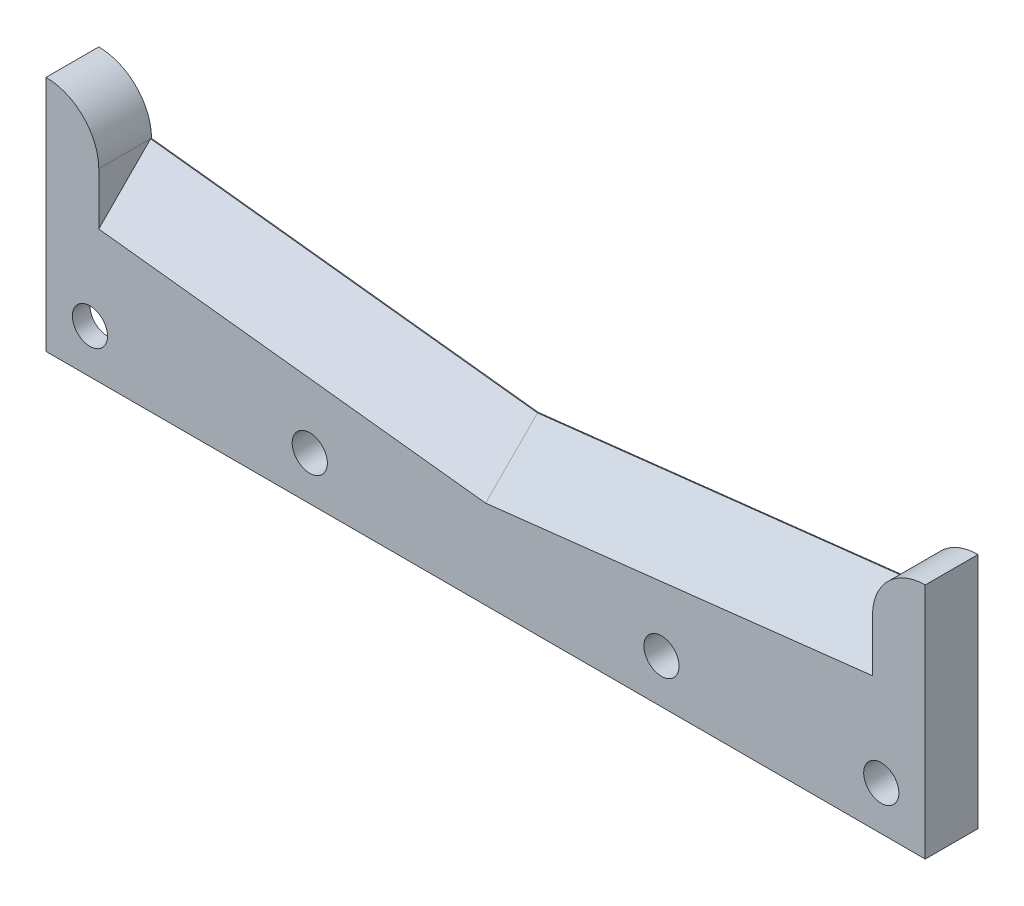
ISO-10303-21;
HEADER;
FILE_DESCRIPTION(('STEP AP214'),'2;1');
FILE_NAME('part.step','',(''),(''),'','','');
FILE_SCHEMA(('AUTOMOTIVE_DESIGN { 1 0 10303 214 1 1 1 1 }'));
ENDSEC;
DATA;
#1=APPLICATION_CONTEXT('core data for automotive mechanical design processes');
#2=APPLICATION_PROTOCOL_DEFINITION('international standard','automotive_design',2000,#1);
#3=PRODUCT_CONTEXT('',#1,'mechanical');
#4=PRODUCT('Part','Part','',(#3));
#5=PRODUCT_RELATED_PRODUCT_CATEGORY('part','',(#4));
#6=PRODUCT_DEFINITION_FORMATION('','',#4);
#7=PRODUCT_DEFINITION_CONTEXT('part definition',#1,'design');
#8=PRODUCT_DEFINITION('design','',#6,#7);
#9=PRODUCT_DEFINITION_SHAPE('','',#8);
#10=(LENGTH_UNIT() NAMED_UNIT(*) SI_UNIT(.MILLI.,.METRE.));
#11=(NAMED_UNIT(*) PLANE_ANGLE_UNIT() SI_UNIT($,.RADIAN.));
#12=(NAMED_UNIT(*) SI_UNIT($,.STERADIAN.) SOLID_ANGLE_UNIT());
#13=UNCERTAINTY_MEASURE_WITH_UNIT(LENGTH_MEASURE(1.E-05),#10,'distance_accuracy_value','');
#14=(GEOMETRIC_REPRESENTATION_CONTEXT(3) GLOBAL_UNCERTAINTY_ASSIGNED_CONTEXT((#13)) GLOBAL_UNIT_ASSIGNED_CONTEXT((#10,
#11,#12)) REPRESENTATION_CONTEXT('',''));
#15=CARTESIAN_POINT('',(0.,0.,0.));
#16=DIRECTION('',(0.,0.,1.));
#17=DIRECTION('',(1.,0.,0.));
#18=AXIS2_PLACEMENT_3D('',#15,#16,#17);
#19=CARTESIAN_POINT('',(0.,0.,0.));
#20=DIRECTION('',(0.,1.,0.));
#21=DIRECTION('',(1.,0.,0.));
#22=AXIS2_PLACEMENT_3D('',#19,#20,#21);
#23=PLANE('',#22);
#24=DIRECTION('',(0.707106781186548,0.,-0.707106781186548));
#25=VECTOR('',#24,1.);
#26=CARTESIAN_POINT('',(16.95000000001,0.,6.95000000001));
#27=LINE('',#26,#25);
#28=CARTESIAN_POINT('',(20.,0.,3.9));
#29=VERTEX_POINT('',#28);
#30=CARTESIAN_POINT('',(23.9,0.,0.));
#31=VERTEX_POINT('',#30);
#32=EDGE_CURVE('E11',#29,#31,#27,.T.);
#33=ORIENTED_EDGE('',*,*,#32,.T.);
#34=DIRECTION('',(1.,0.,0.));
#35=VECTOR('',#34,1.);
#36=CARTESIAN_POINT('',(0.,0.,0.));
#37=LINE('',#36,#35);
#38=CARTESIAN_POINT('',(100.,0.,0.));
#39=VERTEX_POINT('',#38);
#40=EDGE_CURVE('E28',#31,#39,#37,.T.);
#41=ORIENTED_EDGE('',*,*,#40,.T.);
#42=DIRECTION('',(0.,0.,1.));
#43=VECTOR('',#42,1.);
#44=CARTESIAN_POINT('',(100.00000000001,0.,0.));
#45=LINE('',#44,#43);
#46=CARTESIAN_POINT('',(100.,0.,6.));
#47=VERTEX_POINT('',#46);
#48=EDGE_CURVE('E153',#39,#47,#45,.T.);
#49=ORIENTED_EDGE('',*,*,#48,.T.);
#50=DIRECTION('',(1.,0.,0.));
#51=VECTOR('',#50,1.);
#52=CARTESIAN_POINT('',(0.,0.,6.00000000001));
#53=LINE('',#52,#51);
#54=CARTESIAN_POINT('',(0.,0.,6.));
#55=VERTEX_POINT('',#54);
#56=EDGE_CURVE('E149',#55,#47,#53,.T.);
#57=ORIENTED_EDGE('',*,*,#56,.F.);
#58=DIRECTION('',(0.,0.,1.));
#59=VECTOR('',#58,1.);
#60=CARTESIAN_POINT('',(1.00001836970251E-11,0.,0.));
#61=LINE('',#60,#59);
#62=CARTESIAN_POINT('',(0.,0.,4.));
#63=VERTEX_POINT('',#62);
#64=EDGE_CURVE('E151',#63,#55,#61,.T.);
#65=ORIENTED_EDGE('',*,*,#64,.F.);
#66=DIRECTION('',(-1.,0.,0.));
#67=VECTOR('',#66,1.);
#68=CARTESIAN_POINT('',(20.00000000001,0.,4.00000000001));
#69=LINE('',#68,#67);
#70=CARTESIAN_POINT('',(20.,0.,4.));
#71=VERTEX_POINT('',#70);
#72=EDGE_CURVE('E279',#71,#63,#69,.T.);
#73=ORIENTED_EDGE('',*,*,#72,.F.);
#74=DIRECTION('',(0.,0.,1.));
#75=VECTOR('',#74,1.);
#76=CARTESIAN_POINT('',(20.00000000001,0.,0.));
#77=LINE('',#76,#75);
#78=EDGE_CURVE('E234',#29,#71,#77,.T.);
#79=ORIENTED_EDGE('',*,*,#78,.F.);
#80=EDGE_LOOP('',(#33,#41,#49,#57,#65,#73,#79));
#81=FACE_BOUND('',#80,.T.);
#82=ADVANCED_FACE('F17',(#81),#23,.F.);
#83=CARTESIAN_POINT('',(20.,12.727272727273,0.));
#84=DIRECTION('',(1.,0.,0.));
#85=DIRECTION('',(0.,1.,0.));
#86=AXIS2_PLACEMENT_3D('',#83,#84,#85);
#87=PLANE('',#86);
#88=DIRECTION('',(0.,-1.,0.));
#89=VECTOR('',#88,1.);
#90=CARTESIAN_POINT('',(20.00000000001,12.727272727283,3.90000000001));
#91=LINE('',#90,#89);
#92=CARTESIAN_POINT('',(20.,12.727272727273,3.9));
#93=VERTEX_POINT('',#92);
#94=EDGE_CURVE('E237',#93,#29,#91,.T.);
#95=ORIENTED_EDGE('',*,*,#94,.T.);
#96=ORIENTED_EDGE('',*,*,#78,.T.);
#97=DIRECTION('',(0.,-1.,0.));
#98=VECTOR('',#97,1.);
#99=CARTESIAN_POINT('',(20.00000000001,12.727272727283,4.00000000001));
#100=LINE('',#99,#98);
#101=CARTESIAN_POINT('',(20.,12.727272727273,4.));
#102=VERTEX_POINT('',#101);
#103=EDGE_CURVE('E288',#102,#71,#100,.T.);
#104=ORIENTED_EDGE('',*,*,#103,.F.);
#105=DIRECTION('',(0.,0.,1.));
#106=VECTOR('',#105,1.);
#107=CARTESIAN_POINT('',(20.00000000001,12.727272727283,0.));
#108=LINE('',#107,#106);
#109=EDGE_CURVE('E270',#93,#102,#108,.T.);
#110=ORIENTED_EDGE('',*,*,#109,.F.);
#111=EDGE_LOOP('',(#95,#96,#104,#110));
#112=FACE_BOUND('',#111,.T.);
#113=ADVANCED_FACE('F382',(#112),#87,.F.);
#114=CARTESIAN_POINT('',(21.95,12.727272727273,1.95));
#115=DIRECTION('',(-0.707106781186548,0.,-0.707106781186548));
#116=DIRECTION('',(-0.707106781186548,0.,0.707106781186548));
#117=AXIS2_PLACEMENT_3D('',#114,#115,#116);
#118=PLANE('',#117);
#119=DIRECTION('',(0.,-1.,0.));
#120=VECTOR('',#119,1.);
#121=CARTESIAN_POINT('',(23.90000000001,12.727272727283,0.));
#122=LINE('',#121,#120);
#123=CARTESIAN_POINT('',(23.9,16.209190923609,0.));
#124=VERTEX_POINT('',#123);
#125=EDGE_CURVE('E238',#124,#31,#122,.T.);
#126=ORIENTED_EDGE('',*,*,#125,.T.);
#127=ORIENTED_EDGE('',*,*,#32,.F.);
#128=ORIENTED_EDGE('',*,*,#94,.F.);
#129=DIRECTION('',(0.597924984539922,0.533827149671003,-0.597924984539922));
#130=VECTOR('',#129,1.);
#131=CARTESIAN_POINT('',(19.145605724827,11.964469913538,4.754394275193));
#132=LINE('',#131,#130);
#133=EDGE_CURVE('E197',#93,#124,#132,.T.);
#134=ORIENTED_EDGE('',*,*,#133,.T.);
#135=EDGE_LOOP('',(#126,#127,#128,#134));
#136=FACE_BOUND('',#135,.T.);
#137=ADVANCED_FACE('F387',(#136),#118,.T.);
#138=CARTESIAN_POINT('',(0.,0.,4.));
#139=DIRECTION('',(0.,0.,1.));
#140=DIRECTION('',(1.,0.,0.));
#141=AXIS2_PLACEMENT_3D('',#138,#139,#140);
#142=PLANE('',#141);
#143=DIRECTION('',(0.,1.,0.));
#144=VECTOR('',#143,1.);
#145=CARTESIAN_POINT('',(0.,0.,4.00000000001));
#146=LINE('',#145,#144);
#147=CARTESIAN_POINT('',(0.,15.,4.));
#148=VERTEX_POINT('',#147);
#149=EDGE_CURVE('E167',#63,#148,#146,.T.);
#150=ORIENTED_EDGE('',*,*,#149,.T.);
#151=DIRECTION('',(0.99360525478876,-0.112909688052723,0.));
#152=VECTOR('',#151,1.);
#153=CARTESIAN_POINT('',(0.,15.00000000001,4.00000000001));
#154=LINE('',#153,#152);
#155=EDGE_CURVE('E198',#148,#102,#154,.T.);
#156=ORIENTED_EDGE('',*,*,#155,.T.);
#157=ORIENTED_EDGE('',*,*,#103,.T.);
#158=ORIENTED_EDGE('',*,*,#72,.T.);
#159=EDGE_LOOP('',(#150,#156,#157,#158));
#160=FACE_BOUND('',#159,.T.);
#161=CARTESIAN_POINT('',(5.00000000001,5.00000000001,4.00000000001));
#162=DIRECTION('',(0.,0.,1.));
#163=DIRECTION('',(1.,0.,0.));
#164=AXIS2_PLACEMENT_3D('',#161,#162,#163);
#165=CIRCLE('',#164,2.00000000001);
#166=CARTESIAN_POINT('',(7.00000000002,5.00000000001,4.00000000001));
#167=VERTEX_POINT('',#166);
#168=EDGE_CURVE('E276',#167,#167,#165,.T.);
#169=ORIENTED_EDGE('',*,*,#168,.T.);
#170=EDGE_LOOP('',(#169));
#171=FACE_BOUND('',#170,.T.);
#172=ADVANCED_FACE('F384',(#160,#171),#142,.F.);
#173=CARTESIAN_POINT('',(50.,16.,0.));
#174=DIRECTION('',(0.,0.,1.));
#175=DIRECTION('',(1.,0.,0.));
#176=AXIS2_PLACEMENT_3D('',#173,#174,#175);
#177=PLANE('',#176);
#178=CARTESIAN_POINT('',(100.00000000001,21.00000000001,0.));
#179=DIRECTION('',(0.,0.,1.));
#180=DIRECTION('',(1.,0.,0.));
#181=AXIS2_PLACEMENT_3D('',#178,#179,#180);
#182=CIRCLE('',#181,6.00000000001);
#183=CARTESIAN_POINT('',(100.,27.,0.));
#184=VERTEX_POINT('',#183);
#185=CARTESIAN_POINT('',(94.,21.,0.));
#186=VERTEX_POINT('',#185);
#187=EDGE_CURVE('E187',#184,#186,#182,.T.);
#188=ORIENTED_EDGE('',*,*,#187,.F.);
#189=DIRECTION('',(0.,1.,0.));
#190=VECTOR('',#189,1.);
#191=CARTESIAN_POINT('',(100.00000000001,0.,0.));
#192=LINE('',#191,#190);
#193=EDGE_CURVE('E177',#39,#184,#192,.T.);
#194=ORIENTED_EDGE('',*,*,#193,.F.);
#195=ORIENTED_EDGE('',*,*,#40,.F.);
#196=ORIENTED_EDGE('',*,*,#125,.F.);
#197=DIRECTION('',(0.99360525478876,-0.112909688052723,0.));
#198=VECTOR('',#197,1.);
#199=CARTESIAN_POINT('',(6.440347783383,18.193242311872,0.));
#200=LINE('',#199,#198);
#201=CARTESIAN_POINT('',(0.,18.925100014518,0.));
#202=VERTEX_POINT('',#201);
#203=EDGE_CURVE('E228',#202,#124,#200,.T.);
#204=ORIENTED_EDGE('',*,*,#203,.F.);
#205=DIRECTION('',(0.,-1.,0.));
#206=VECTOR('',#205,1.);
#207=CARTESIAN_POINT('',(0.,21.00000000001,0.));
#208=LINE('',#207,#206);
#209=CARTESIAN_POINT('',(0.,27.,0.));
#210=VERTEX_POINT('',#209);
#211=EDGE_CURVE('E229',#210,#202,#208,.T.);
#212=ORIENTED_EDGE('',*,*,#211,.F.);
#213=CARTESIAN_POINT('',(0.,21.00000000001,0.));
#214=DIRECTION('',(0.,0.,1.));
#215=DIRECTION('',(1.,0.,0.));
#216=AXIS2_PLACEMENT_3D('',#213,#214,#215);
#217=CIRCLE('',#216,6.00000000001);
#218=CARTESIAN_POINT('',(6.,21.,0.));
#219=VERTEX_POINT('',#218);
#220=EDGE_CURVE('E220',#219,#210,#217,.T.);
#221=ORIENTED_EDGE('',*,*,#220,.F.);
#222=DIRECTION('',(-0.99360525478876,0.112909688052723,0.));
#223=VECTOR('',#222,1.);
#224=CARTESIAN_POINT('',(50.00000000001,16.00000000001,0.));
#225=LINE('',#224,#223);
#226=CARTESIAN_POINT('',(50.,16.,0.));
#227=VERTEX_POINT('',#226);
#228=EDGE_CURVE('E189',#227,#219,#225,.T.);
#229=ORIENTED_EDGE('',*,*,#228,.F.);
#230=DIRECTION('',(0.99360525478876,0.112909688052723,0.));
#231=VECTOR('',#230,1.);
#232=CARTESIAN_POINT('',(50.00000000001,16.00000000001,0.));
#233=LINE('',#232,#231);
#234=EDGE_CURVE('E280',#227,#186,#233,.T.);
#235=ORIENTED_EDGE('',*,*,#234,.T.);
#236=EDGE_LOOP('',(#188,#194,#195,#196,#204,#212,#221,#229,#235));
#237=FACE_BOUND('',#236,.T.);
#238=CARTESIAN_POINT('',(70.00000000001,5.00000000001,0.));
#239=DIRECTION('',(0.,0.,1.));
#240=DIRECTION('',(1.,0.,0.));
#241=AXIS2_PLACEMENT_3D('',#238,#239,#240);
#242=CIRCLE('',#241,2.00000000001);
#243=CARTESIAN_POINT('',(72.00000000002,5.00000000001,0.));
#244=VERTEX_POINT('',#243);
#245=EDGE_CURVE('E292',#244,#244,#242,.T.);
#246=ORIENTED_EDGE('',*,*,#245,.T.);
#247=EDGE_LOOP('',(#246));
#248=FACE_BOUND('',#247,.T.);
#249=CARTESIAN_POINT('',(30.00000000001,5.00000000001,0.));
#250=DIRECTION('',(0.,0.,1.));
#251=DIRECTION('',(1.,0.,0.));
#252=AXIS2_PLACEMENT_3D('',#249,#250,#251);
#253=CIRCLE('',#252,2.00000000001);
#254=CARTESIAN_POINT('',(32.00000000002,5.00000000001,0.));
#255=VERTEX_POINT('',#254);
#256=EDGE_CURVE('E263',#255,#255,#253,.T.);
#257=ORIENTED_EDGE('',*,*,#256,.T.);
#258=EDGE_LOOP('',(#257));
#259=FACE_BOUND('',#258,.T.);
#260=CARTESIAN_POINT('',(95.00000000001,5.00000000001,0.));
#261=DIRECTION('',(0.,0.,1.));
#262=DIRECTION('',(1.,0.,0.));
#263=AXIS2_PLACEMENT_3D('',#260,#261,#262);
#264=CIRCLE('',#263,2.00000000001);
#265=CARTESIAN_POINT('',(97.00000000002,5.00000000001,0.));
#266=VERTEX_POINT('',#265);
#267=EDGE_CURVE('E168',#266,#266,#264,.T.);
#268=ORIENTED_EDGE('',*,*,#267,.T.);
#269=EDGE_LOOP('',(#268));
#270=FACE_BOUND('',#269,.T.);
#271=ADVANCED_FACE('F370',(#237,#248,#259,#270),#177,.F.);
#272=CARTESIAN_POINT('',(0.,0.,0.));
#273=DIRECTION('',(-1.,0.,0.));
#274=DIRECTION('',(0.,0.,1.));
#275=AXIS2_PLACEMENT_3D('',#272,#273,#274);
#276=PLANE('',#275);
#277=ORIENTED_EDGE('',*,*,#149,.F.);
#278=ORIENTED_EDGE('',*,*,#64,.T.);
#279=DIRECTION('',(0.,1.,0.));
#280=VECTOR('',#279,1.);
#281=CARTESIAN_POINT('',(1.00003673940397E-11,0.,6.00000000001));
#282=LINE('',#281,#280);
#283=CARTESIAN_POINT('',(0.,27.,6.));
#284=VERTEX_POINT('',#283);
#285=EDGE_CURVE('E163',#55,#284,#282,.T.);
#286=ORIENTED_EDGE('',*,*,#285,.T.);
#287=DIRECTION('',(0.,0.,1.));
#288=VECTOR('',#287,1.);
#289=CARTESIAN_POINT('',(1.00003673940397E-11,27.00000000001,0.));
#290=LINE('',#289,#288);
#291=EDGE_CURVE('E224',#210,#284,#290,.T.);
#292=ORIENTED_EDGE('',*,*,#291,.F.);
#293=ORIENTED_EDGE('',*,*,#211,.T.);
#294=DIRECTION('',(0.,0.709371267804266,-0.704835019287328));
#295=VECTOR('',#294,1.);
#296=CARTESIAN_POINT('',(1.00003641082614E-11,13.175902906889,5.712432456982));
#297=LINE('',#296,#295);
#298=CARTESIAN_POINT('',(0.,15.,3.9));
#299=VERTEX_POINT('',#298);
#300=EDGE_CURVE('E209',#299,#202,#297,.T.);
#301=ORIENTED_EDGE('',*,*,#300,.F.);
#302=DIRECTION('',(0.,0.,1.));
#303=VECTOR('',#302,1.);
#304=CARTESIAN_POINT('',(0.,15.00000000001,0.));
#305=LINE('',#304,#303);
#306=EDGE_CURVE('E225',#299,#148,#305,.T.);
#307=ORIENTED_EDGE('',*,*,#306,.T.);
#308=EDGE_LOOP('',(#277,#278,#286,#292,#293,#301,#307));
#309=FACE_BOUND('',#308,.T.);
#310=ADVANCED_FACE('F161',(#309),#276,.T.);
#311=CARTESIAN_POINT('',(100.,0.,0.));
#312=DIRECTION('',(-1.,0.,0.));
#313=DIRECTION('',(0.,0.,1.));
#314=AXIS2_PLACEMENT_3D('',#311,#312,#313);
#315=PLANE('',#314);
#316=ORIENTED_EDGE('',*,*,#193,.T.);
#317=DIRECTION('',(0.,0.,1.));
#318=VECTOR('',#317,1.);
#319=CARTESIAN_POINT('',(100.00000000001,27.00000000001,0.));
#320=LINE('',#319,#318);
#321=CARTESIAN_POINT('',(100.,27.,6.));
#322=VERTEX_POINT('',#321);
#323=EDGE_CURVE('E251',#184,#322,#320,.T.);
#324=ORIENTED_EDGE('',*,*,#323,.T.);
#325=DIRECTION('',(0.,1.,0.));
#326=VECTOR('',#325,1.);
#327=CARTESIAN_POINT('',(100.00000000001,0.,6.00000000001));
#328=LINE('',#327,#326);
#329=EDGE_CURVE('E158',#47,#322,#328,.T.);
#330=ORIENTED_EDGE('',*,*,#329,.F.);
#331=ORIENTED_EDGE('',*,*,#48,.F.);
#332=EDGE_LOOP('',(#316,#324,#330,#331));
#333=FACE_BOUND('',#332,.T.);
#334=ADVANCED_FACE('F618',(#333),#315,.F.);
#335=CARTESIAN_POINT('',(50.,16.,6.));
#336=DIRECTION('',(0.,0.,1.));
#337=DIRECTION('',(1.,0.,0.));
#338=AXIS2_PLACEMENT_3D('',#335,#336,#337);
#339=PLANE('',#338);
#340=DIRECTION('',(-0.99360525478876,0.112909688052723,0.));
#341=VECTOR('',#340,1.);
#342=CARTESIAN_POINT('',(49.333832840549,10.137728996751,6.00000000001));
#343=LINE('',#342,#341);
#344=CARTESIAN_POINT('',(50.,10.062028183166,6.));
#345=VERTEX_POINT('',#344);
#346=CARTESIAN_POINT('',(6.,15.062028183166,6.));
#347=VERTEX_POINT('',#346);
#348=EDGE_CURVE('E157',#345,#347,#343,.T.);
#349=ORIENTED_EDGE('',*,*,#348,.T.);
#350=DIRECTION('',(0.,1.,0.));
#351=VECTOR('',#350,1.);
#352=CARTESIAN_POINT('',(6.00000000001,11.00000000001,6.00000000001));
#353=LINE('',#352,#351);
#354=CARTESIAN_POINT('',(6.,21.,6.));
#355=VERTEX_POINT('',#354);
#356=EDGE_CURVE('E213',#347,#355,#353,.T.);
#357=ORIENTED_EDGE('',*,*,#356,.T.);
#358=CARTESIAN_POINT('',(0.,21.00000000001,6.00000000001));
#359=DIRECTION('',(0.,0.,1.));
#360=DIRECTION('',(1.,0.,0.));
#361=AXIS2_PLACEMENT_3D('',#358,#359,#360);
#362=CIRCLE('',#361,6.00000000001);
#363=EDGE_CURVE('E175',#355,#284,#362,.T.);
#364=ORIENTED_EDGE('',*,*,#363,.T.);
#365=ORIENTED_EDGE('',*,*,#285,.F.);
#366=ORIENTED_EDGE('',*,*,#56,.T.);
#367=ORIENTED_EDGE('',*,*,#329,.T.);
#368=CARTESIAN_POINT('',(100.00000000001,21.00000000001,6.00000000001));
#369=DIRECTION('',(0.,0.,1.));
#370=DIRECTION('',(1.,0.,0.));
#371=AXIS2_PLACEMENT_3D('',#368,#369,#370);
#372=CIRCLE('',#371,6.00000000001);
#373=CARTESIAN_POINT('',(94.,21.,6.));
#374=VERTEX_POINT('',#373);
#375=EDGE_CURVE('E216',#322,#374,#372,.T.);
#376=ORIENTED_EDGE('',*,*,#375,.T.);
#377=DIRECTION('',(0.,-1.,0.));
#378=VECTOR('',#377,1.);
#379=CARTESIAN_POINT('',(94.00000000001,21.00000000001,6.00000000001));
#380=LINE('',#379,#378);
#381=CARTESIAN_POINT('',(94.,15.062028183166,6.));
#382=VERTEX_POINT('',#381);
#383=EDGE_CURVE('E250',#374,#382,#380,.T.);
#384=ORIENTED_EDGE('',*,*,#383,.T.);
#385=DIRECTION('',(0.99360525478876,0.112909688052723,0.));
#386=VECTOR('',#385,1.);
#387=CARTESIAN_POINT('',(50.666167159471,10.137728996751,6.00000000001));
#388=LINE('',#387,#386);
#389=EDGE_CURVE('E212',#345,#382,#388,.T.);
#390=ORIENTED_EDGE('',*,*,#389,.F.);
#391=EDGE_LOOP('',(#349,#357,#364,#365,#366,#367,#376,#384,#390));
#392=FACE_BOUND('',#391,.T.);
#393=CARTESIAN_POINT('',(5.00000000001,5.00000000001,6.00000000001));
#394=DIRECTION('',(0.,0.,1.));
#395=DIRECTION('',(1.,0.,0.));
#396=AXIS2_PLACEMENT_3D('',#393,#394,#395);
#397=CIRCLE('',#396,2.00000000001);
#398=CARTESIAN_POINT('',(7.00000000002,5.00000000001,6.00000000001));
#399=VERTEX_POINT('',#398);
#400=EDGE_CURVE('E193',#399,#399,#397,.T.);
#401=ORIENTED_EDGE('',*,*,#400,.F.);
#402=EDGE_LOOP('',(#401));
#403=FACE_BOUND('',#402,.T.);
#404=CARTESIAN_POINT('',(30.00000000001,5.00000000001,6.00000000001));
#405=DIRECTION('',(0.,0.,1.));
#406=DIRECTION('',(1.,0.,0.));
#407=AXIS2_PLACEMENT_3D('',#404,#405,#406);
#408=CIRCLE('',#407,2.00000000001);
#409=CARTESIAN_POINT('',(32.00000000002,5.00000000001,6.00000000001));
#410=VERTEX_POINT('',#409);
#411=EDGE_CURVE('E240',#410,#410,#408,.T.);
#412=ORIENTED_EDGE('',*,*,#411,.F.);
#413=EDGE_LOOP('',(#412));
#414=FACE_BOUND('',#413,.T.);
#415=CARTESIAN_POINT('',(95.00000000001,5.00000000001,6.00000000001));
#416=DIRECTION('',(0.,0.,1.));
#417=DIRECTION('',(1.,0.,0.));
#418=AXIS2_PLACEMENT_3D('',#415,#416,#417);
#419=CIRCLE('',#418,2.00000000001);
#420=CARTESIAN_POINT('',(97.00000000002,5.00000000001,6.00000000001));
#421=VERTEX_POINT('',#420);
#422=EDGE_CURVE('E21',#421,#421,#419,.T.);
#423=ORIENTED_EDGE('',*,*,#422,.F.);
#424=EDGE_LOOP('',(#423));
#425=FACE_BOUND('',#424,.T.);
#426=CARTESIAN_POINT('',(70.00000000001,5.00000000001,6.00000000001));
#427=DIRECTION('',(0.,0.,1.));
#428=DIRECTION('',(1.,0.,0.));
#429=AXIS2_PLACEMENT_3D('',#426,#427,#428);
#430=CIRCLE('',#429,2.00000000001);
#431=CARTESIAN_POINT('',(72.00000000002,5.00000000001,6.00000000001));
#432=VERTEX_POINT('',#431);
#433=EDGE_CURVE('E244',#432,#432,#430,.T.);
#434=ORIENTED_EDGE('',*,*,#433,.F.);
#435=EDGE_LOOP('',(#434));
#436=FACE_BOUND('',#435,.T.);
#437=ADVANCED_FACE('F172',(#392,#403,#414,#425,#436),#339,.T.);
#438=CARTESIAN_POINT('',(0.,15.,0.));
#439=DIRECTION('',(0.112909688043972,0.993605254789754,0.));
#440=DIRECTION('',(0.,0.,-1.));
#441=AXIS2_PLACEMENT_3D('',#438,#439,#440);
#442=PLANE('',#441);
#443=DIRECTION('',(0.99360525478876,-0.112909688052723,0.));
#444=VECTOR('',#443,1.);
#445=CARTESIAN_POINT('',(1.00001387778781E-11,15.00000000001,3.90000000001));
#446=LINE('',#445,#444);
#447=EDGE_CURVE('E341',#299,#93,#446,.T.);
#448=ORIENTED_EDGE('',*,*,#447,.T.);
#449=ORIENTED_EDGE('',*,*,#109,.T.);
#450=ORIENTED_EDGE('',*,*,#155,.F.);
#451=ORIENTED_EDGE('',*,*,#306,.F.);
#452=EDGE_LOOP('',(#448,#449,#450,#451));
#453=FACE_BOUND('',#452,.T.);
#454=ADVANCED_FACE('F379',(#453),#442,.F.);
#455=CARTESIAN_POINT('',(6.220173891686,16.255712065022,1.95));
#456=DIRECTION('',(-0.0798392060777668,-0.702585013483972,-0.707106781186971));
#457=DIRECTION('',(0.,-0.709371267804773,0.704835019286818));
#458=AXIS2_PLACEMENT_3D('',#455,#456,#457);
#459=PLANE('',#458);
#460=ORIENTED_EDGE('',*,*,#203,.T.);
#461=ORIENTED_EDGE('',*,*,#133,.F.);
#462=ORIENTED_EDGE('',*,*,#447,.F.);
#463=ORIENTED_EDGE('',*,*,#300,.T.);
#464=EDGE_LOOP('',(#460,#461,#462,#463));
#465=FACE_BOUND('',#464,.T.);
#466=ADVANCED_FACE('F375',(#465),#459,.T.);
#467=CARTESIAN_POINT('',(5.,5.,6.));
#468=DIRECTION('',(0.,0.,1.));
#469=DIRECTION('',(1.,0.,0.));
#470=AXIS2_PLACEMENT_3D('',#467,#468,#469);
#471=CYLINDRICAL_SURFACE('',#470,2.);
#472=ORIENTED_EDGE('',*,*,#168,.F.);
#473=EDGE_LOOP('',(#472));
#474=FACE_BOUND('',#473,.T.);
#475=ORIENTED_EDGE('',*,*,#400,.T.);
#476=EDGE_LOOP('',(#475));
#477=FACE_BOUND('',#476,.T.);
#478=ADVANCED_FACE('F644',(#474,#477),#471,.F.);
#479=CARTESIAN_POINT('',(50.,16.,0.));
#480=DIRECTION('',(-0.112909688043972,-0.993605254789754,0.));
#481=DIRECTION('',(-0.993605254789754,0.112909688043972,0.));
#482=AXIS2_PLACEMENT_3D('',#479,#480,#481);
#483=PLANE('',#482);
#484=ORIENTED_EDGE('',*,*,#228,.T.);
#485=DIRECTION('',(0.,0.,-1.));
#486=VECTOR('',#485,1.);
#487=CARTESIAN_POINT('',(6.00000000001,21.00000000001,6.00000000001));
#488=LINE('',#487,#486);
#489=CARTESIAN_POINT('',(6.,21.,0.1));
#490=VERTEX_POINT('',#489);
#491=EDGE_CURVE('E273',#490,#219,#488,.T.);
#492=ORIENTED_EDGE('',*,*,#491,.F.);
#493=DIRECTION('',(-0.99360525478876,0.112909688052723,0.));
#494=VECTOR('',#493,1.);
#495=CARTESIAN_POINT('',(50.00000000001,16.00000000001,0.10000000001));
#496=LINE('',#495,#494);
#497=CARTESIAN_POINT('',(50.,16.,0.1));
#498=VERTEX_POINT('',#497);
#499=EDGE_CURVE('E232',#498,#490,#496,.T.);
#500=ORIENTED_EDGE('',*,*,#499,.F.);
#501=DIRECTION('',(0.,0.,1.));
#502=VECTOR('',#501,1.);
#503=CARTESIAN_POINT('',(50.00000000001,16.00000000001,0.));
#504=LINE('',#503,#502);
#505=EDGE_CURVE('E194',#227,#498,#504,.T.);
#506=ORIENTED_EDGE('',*,*,#505,.F.);
#507=EDGE_LOOP('',(#484,#492,#500,#506));
#508=FACE_BOUND('',#507,.T.);
#509=ADVANCED_FACE('F360',(#508),#483,.F.);
#510=CARTESIAN_POINT('',(50.,16.,0.));
#511=DIRECTION('',(-0.112909688043972,0.993605254789754,0.));
#512=DIRECTION('',(0.,0.,1.));
#513=AXIS2_PLACEMENT_3D('',#510,#511,#512);
#514=PLANE('',#513);
#515=ORIENTED_EDGE('',*,*,#505,.T.);
#516=DIRECTION('',(0.99360525478876,0.112909688052723,0.));
#517=VECTOR('',#516,1.);
#518=CARTESIAN_POINT('',(50.00000000001,16.00000000001,0.10000000001));
#519=LINE('',#518,#517);
#520=CARTESIAN_POINT('',(94.,21.,0.1));
#521=VERTEX_POINT('',#520);
#522=EDGE_CURVE('E199',#498,#521,#519,.T.);
#523=ORIENTED_EDGE('',*,*,#522,.T.);
#524=DIRECTION('',(0.,0.,-1.));
#525=VECTOR('',#524,1.);
#526=CARTESIAN_POINT('',(94.00000000001,21.00000000001,6.00000000001));
#527=LINE('',#526,#525);
#528=EDGE_CURVE('E203',#521,#186,#527,.T.);
#529=ORIENTED_EDGE('',*,*,#528,.T.);
#530=ORIENTED_EDGE('',*,*,#234,.F.);
#531=EDGE_LOOP('',(#515,#523,#529,#530));
#532=FACE_BOUND('',#531,.T.);
#533=ADVANCED_FACE('F658',(#532),#514,.T.);
#534=CARTESIAN_POINT('',(70.,5.,6.));
#535=DIRECTION('',(0.,0.,1.));
#536=DIRECTION('',(1.,0.,0.));
#537=AXIS2_PLACEMENT_3D('',#534,#535,#536);
#538=CYLINDRICAL_SURFACE('',#537,2.);
#539=ORIENTED_EDGE('',*,*,#245,.F.);
#540=EDGE_LOOP('',(#539));
#541=FACE_BOUND('',#540,.T.);
#542=ORIENTED_EDGE('',*,*,#433,.T.);
#543=EDGE_LOOP('',(#542));
#544=FACE_BOUND('',#543,.T.);
#545=ADVANCED_FACE('F665',(#541,#544),#538,.F.);
#546=CARTESIAN_POINT('',(30.,5.,6.));
#547=DIRECTION('',(0.,0.,1.));
#548=DIRECTION('',(1.,0.,0.));
#549=AXIS2_PLACEMENT_3D('',#546,#547,#548);
#550=CYLINDRICAL_SURFACE('',#549,2.);
#551=ORIENTED_EDGE('',*,*,#256,.F.);
#552=EDGE_LOOP('',(#551));
#553=FACE_BOUND('',#552,.T.);
#554=ORIENTED_EDGE('',*,*,#411,.T.);
#555=EDGE_LOOP('',(#554));
#556=FACE_BOUND('',#555,.T.);
#557=ADVANCED_FACE('F673',(#553,#556),#550,.F.);
#558=CARTESIAN_POINT('',(95.,5.,6.));
#559=DIRECTION('',(0.,0.,1.));
#560=DIRECTION('',(1.,0.,0.));
#561=AXIS2_PLACEMENT_3D('',#558,#559,#560);
#562=CYLINDRICAL_SURFACE('',#561,2.);
#563=ORIENTED_EDGE('',*,*,#267,.F.);
#564=EDGE_LOOP('',(#563));
#565=FACE_BOUND('',#564,.T.);
#566=ORIENTED_EDGE('',*,*,#422,.T.);
#567=EDGE_LOOP('',(#566));
#568=FACE_BOUND('',#567,.T.);
#569=ADVANCED_FACE('F19',(#565,#568),#562,.F.);
#570=CARTESIAN_POINT('',(49.666916420269,13.06886449837,3.05));
#571=DIRECTION('',(-0.0798392060777668,-0.702585013483972,-0.707106781186971));
#572=DIRECTION('',(0.,-0.709371267804773,0.704835019286818));
#573=AXIS2_PLACEMENT_3D('',#570,#571,#572);
#574=PLANE('',#573);
#575=DIRECTION('',(0.,-0.709371267804266,0.704835019287328));
#576=VECTOR('',#575,1.);
#577=CARTESIAN_POINT('',(50.00000000001,13.050060703784,3.031075186051));
#578=LINE('',#577,#576);
#579=EDGE_CURVE('E204',#498,#345,#578,.T.);
#580=ORIENTED_EDGE('',*,*,#579,.F.);
#581=ORIENTED_EDGE('',*,*,#499,.T.);
#582=DIRECTION('',(0.,0.709371267804266,-0.704835019287328));
#583=VECTOR('',#582,1.);
#584=CARTESIAN_POINT('',(6.00000000001,14.276003736887,6.780998020236));
#585=LINE('',#584,#583);
#586=EDGE_CURVE('E255',#347,#490,#585,.T.);
#587=ORIENTED_EDGE('',*,*,#586,.F.);
#588=ORIENTED_EDGE('',*,*,#348,.F.);
#589=EDGE_LOOP('',(#580,#581,#587,#588));
#590=FACE_BOUND('',#589,.T.);
#591=ADVANCED_FACE('F367',(#590),#574,.F.);
#592=CARTESIAN_POINT('',(50.333083579731,13.06886449837,3.05));
#593=DIRECTION('',(-0.0798392060777668,0.702585013483972,0.707106781186972));
#594=DIRECTION('',(0.993605254789712,0.112909688044346,0.));
#595=AXIS2_PLACEMENT_3D('',#592,#593,#594);
#596=PLANE('',#595);
#597=ORIENTED_EDGE('',*,*,#389,.T.);
#598=DIRECTION('',(0.,0.709371267804266,-0.704835019287328));
#599=VECTOR('',#598,1.);
#600=CARTESIAN_POINT('',(94.00000000001,16.792041714818,4.281049464112));
#601=LINE('',#600,#599);
#602=EDGE_CURVE('E208',#382,#521,#601,.T.);
#603=ORIENTED_EDGE('',*,*,#602,.T.);
#604=ORIENTED_EDGE('',*,*,#522,.F.);
#605=ORIENTED_EDGE('',*,*,#579,.T.);
#606=EDGE_LOOP('',(#597,#603,#604,#605));
#607=FACE_BOUND('',#606,.T.);
#608=ADVANCED_FACE('F693',(#607),#596,.T.);
#609=CARTESIAN_POINT('',(0.,21.,0.));
#610=DIRECTION('',(0.,0.,-1.));
#611=DIRECTION('',(1.,0.,0.));
#612=AXIS2_PLACEMENT_3D('',#609,#610,#611);
#613=CYLINDRICAL_SURFACE('',#612,6.);
#614=ORIENTED_EDGE('',*,*,#220,.T.);
#615=ORIENTED_EDGE('',*,*,#291,.T.);
#616=ORIENTED_EDGE('',*,*,#363,.F.);
#617=EDGE_CURVE('E247',#355,#490,#488,.T.);
#618=ORIENTED_EDGE('',*,*,#617,.T.);
#619=ORIENTED_EDGE('',*,*,#491,.T.);
#620=EDGE_LOOP('',(#614,#615,#616,#618,#619));
#621=FACE_BOUND('',#620,.T.);
#622=ADVANCED_FACE('F368',(#621),#613,.T.);
#623=CARTESIAN_POINT('',(100.,21.,0.));
#624=DIRECTION('',(0.,0.,-1.));
#625=DIRECTION('',(1.,0.,0.));
#626=AXIS2_PLACEMENT_3D('',#623,#624,#625);
#627=CYLINDRICAL_SURFACE('',#626,6.);
#628=ORIENTED_EDGE('',*,*,#375,.F.);
#629=ORIENTED_EDGE('',*,*,#323,.F.);
#630=ORIENTED_EDGE('',*,*,#187,.T.);
#631=ORIENTED_EDGE('',*,*,#528,.F.);
#632=EDGE_CURVE('E259',#374,#521,#527,.T.);
#633=ORIENTED_EDGE('',*,*,#632,.F.);
#634=EDGE_LOOP('',(#628,#629,#630,#631,#633));
#635=FACE_BOUND('',#634,.T.);
#636=ADVANCED_FACE('F707',(#635),#627,.T.);
#637=CARTESIAN_POINT('',(6.,11.,6.));
#638=DIRECTION('',(1.,0.,0.));
#639=DIRECTION('',(0.,1.,0.));
#640=AXIS2_PLACEMENT_3D('',#637,#638,#639);
#641=PLANE('',#640);
#642=ORIENTED_EDGE('',*,*,#356,.F.);
#643=ORIENTED_EDGE('',*,*,#586,.T.);
#644=ORIENTED_EDGE('',*,*,#617,.F.);
#645=EDGE_LOOP('',(#642,#643,#644));
#646=FACE_BOUND('',#645,.T.);
#647=ADVANCED_FACE('F355',(#646),#641,.T.);
#648=CARTESIAN_POINT('',(94.,21.,6.));
#649=DIRECTION('',(-1.,0.,0.));
#650=DIRECTION('',(0.,0.,1.));
#651=AXIS2_PLACEMENT_3D('',#648,#649,#650);
#652=PLANE('',#651);
#653=ORIENTED_EDGE('',*,*,#383,.F.);
#654=ORIENTED_EDGE('',*,*,#632,.T.);
#655=ORIENTED_EDGE('',*,*,#602,.F.);
#656=EDGE_LOOP('',(#653,#654,#655));
#657=FACE_BOUND('',#656,.T.);
#658=ADVANCED_FACE('F721',(#657),#652,.T.);
#659=CLOSED_SHELL('',(#82,#113,#137,#172,#271,#310,#334,#437,#454,#466,#478,#509,#533,#545,#557,
#569,#591,#608,#622,#636,#647,#658));
#660=MANIFOLD_SOLID_BREP('B1',#659);
#661=ADVANCED_BREP_SHAPE_REPRESENTATION('',(#18,#660),#14);
#662=SHAPE_DEFINITION_REPRESENTATION(#9,#661);
ENDSEC;
END-ISO-10303-21;
